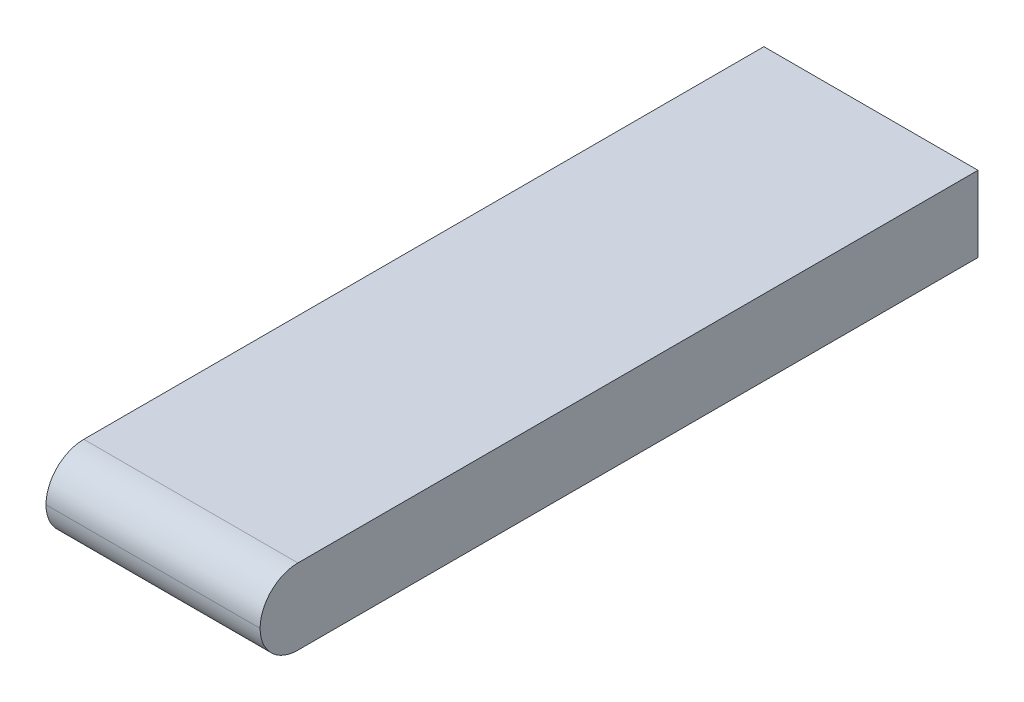
ISO-10303-21;
HEADER;
FILE_DESCRIPTION(('STEP AP214'),'2;1');
FILE_NAME('part.step','',(''),(''),'','','');
FILE_SCHEMA(('AUTOMOTIVE_DESIGN { 1 0 10303 214 1 1 1 1 }'));
ENDSEC;
DATA;
#1=APPLICATION_CONTEXT('core data for automotive mechanical design processes');
#2=APPLICATION_PROTOCOL_DEFINITION('international standard','automotive_design',2000,#1);
#3=PRODUCT_CONTEXT('',#1,'mechanical');
#4=PRODUCT('Part','Part','',(#3));
#5=PRODUCT_RELATED_PRODUCT_CATEGORY('part','',(#4));
#6=PRODUCT_DEFINITION_FORMATION('','',#4);
#7=PRODUCT_DEFINITION_CONTEXT('part definition',#1,'design');
#8=PRODUCT_DEFINITION('design','',#6,#7);
#9=PRODUCT_DEFINITION_SHAPE('','',#8);
#10=(LENGTH_UNIT() NAMED_UNIT(*) SI_UNIT(.MILLI.,.METRE.));
#11=(NAMED_UNIT(*) PLANE_ANGLE_UNIT() SI_UNIT($,.RADIAN.));
#12=(NAMED_UNIT(*) SI_UNIT($,.STERADIAN.) SOLID_ANGLE_UNIT());
#13=UNCERTAINTY_MEASURE_WITH_UNIT(LENGTH_MEASURE(1.E-05),#10,'distance_accuracy_value','');
#14=(GEOMETRIC_REPRESENTATION_CONTEXT(3) GLOBAL_UNCERTAINTY_ASSIGNED_CONTEXT((#13)) GLOBAL_UNIT_ASSIGNED_CONTEXT((#10,
#11,#12)) REPRESENTATION_CONTEXT('',''));
#15=CARTESIAN_POINT('',(0.,0.,0.));
#16=DIRECTION('',(0.,0.,1.));
#17=DIRECTION('',(1.,0.,0.));
#18=AXIS2_PLACEMENT_3D('',#15,#16,#17);
#19=CARTESIAN_POINT('',(-21.59,15.24,-72.39));
#20=DIRECTION('',(1.,0.,0.));
#21=DIRECTION('',(0.,0.,-1.));
#22=AXIS2_PLACEMENT_3D('',#19,#20,#21);
#23=PLANE('',#22);
#24=DIRECTION('',(0.,0.,1.));
#25=VECTOR('',#24,1.);
#26=CARTESIAN_POINT('',(-21.59,0.,-72.39));
#27=LINE('',#26,#25);
#28=CARTESIAN_POINT('',(-21.59,0.,-72.39));
#29=VERTEX_POINT('',#28);
#30=CARTESIAN_POINT('',(-21.59,0.,64.77));
#31=VERTEX_POINT('',#30);
#32=EDGE_CURVE('E104',#29,#31,#27,.T.);
#33=ORIENTED_EDGE('',*,*,#32,.T.);
#34=CARTESIAN_POINT('',(-21.59,7.62,64.77));
#35=DIRECTION('',(1.,0.,0.));
#36=DIRECTION('',(0.,0.,-1.));
#37=AXIS2_PLACEMENT_3D('',#34,#35,#36);
#38=CIRCLE('',#37,7.62);
#39=CARTESIAN_POINT('',(-21.59,7.62,72.39));
#40=VERTEX_POINT('',#39);
#41=EDGE_CURVE('E42',#31,#40,#38,.F.);
#42=ORIENTED_EDGE('',*,*,#41,.T.);
#43=CARTESIAN_POINT('',(-21.59,7.62,64.77));
#44=DIRECTION('',(1.,0.,0.));
#45=DIRECTION('',(0.,0.,-1.));
#46=AXIS2_PLACEMENT_3D('',#43,#44,#45);
#47=CIRCLE('',#46,7.62);
#48=CARTESIAN_POINT('',(-21.59,15.24,64.77));
#49=VERTEX_POINT('',#48);
#50=EDGE_CURVE('E49',#40,#49,#47,.F.);
#51=ORIENTED_EDGE('',*,*,#50,.T.);
#52=DIRECTION('',(0.,0.,1.));
#53=VECTOR('',#52,1.);
#54=CARTESIAN_POINT('',(-21.59,15.24,-72.39));
#55=LINE('',#54,#53);
#56=CARTESIAN_POINT('',(-21.59,15.24,-72.39));
#57=VERTEX_POINT('',#56);
#58=EDGE_CURVE('E86',#57,#49,#55,.T.);
#59=ORIENTED_EDGE('',*,*,#58,.F.);
#60=DIRECTION('',(0.,-1.,0.));
#61=VECTOR('',#60,1.);
#62=CARTESIAN_POINT('',(-21.59,15.24,-72.39));
#63=LINE('',#62,#61);
#64=EDGE_CURVE('E96',#57,#29,#63,.T.);
#65=ORIENTED_EDGE('',*,*,#64,.T.);
#66=EDGE_LOOP('',(#33,#42,#51,#59,#65));
#67=FACE_BOUND('',#66,.T.);
#68=ADVANCED_FACE('F33',(#67),#23,.F.);
#69=CARTESIAN_POINT('',(21.59,15.24,-72.39));
#70=DIRECTION('',(-1.,0.,0.));
#71=DIRECTION('',(0.,0.,1.));
#72=AXIS2_PLACEMENT_3D('',#69,#70,#71);
#73=PLANE('',#72);
#74=CARTESIAN_POINT('',(21.59,7.62,64.77));
#75=DIRECTION('',(-1.,0.,0.));
#76=DIRECTION('',(0.,0.,1.));
#77=AXIS2_PLACEMENT_3D('',#74,#75,#76);
#78=CIRCLE('',#77,7.62);
#79=CARTESIAN_POINT('',(21.59,15.24,64.77));
#80=VERTEX_POINT('',#79);
#81=CARTESIAN_POINT('',(21.59,7.62,72.39));
#82=VERTEX_POINT('',#81);
#83=EDGE_CURVE('E95',#80,#82,#78,.F.);
#84=ORIENTED_EDGE('',*,*,#83,.T.);
#85=CARTESIAN_POINT('',(21.59,7.62,64.77));
#86=DIRECTION('',(-1.,0.,0.));
#87=DIRECTION('',(0.,0.,1.));
#88=AXIS2_PLACEMENT_3D('',#85,#86,#87);
#89=CIRCLE('',#88,7.62);
#90=CARTESIAN_POINT('',(21.59,0.,64.77));
#91=VERTEX_POINT('',#90);
#92=EDGE_CURVE('E110',#82,#91,#89,.F.);
#93=ORIENTED_EDGE('',*,*,#92,.T.);
#94=DIRECTION('',(0.,0.,-1.));
#95=VECTOR('',#94,1.);
#96=CARTESIAN_POINT('',(21.59,0.,-72.39));
#97=LINE('',#96,#95);
#98=CARTESIAN_POINT('',(21.59,0.,-72.39));
#99=VERTEX_POINT('',#98);
#100=EDGE_CURVE('E92',#91,#99,#97,.T.);
#101=ORIENTED_EDGE('',*,*,#100,.T.);
#102=DIRECTION('',(0.,-1.,0.));
#103=VECTOR('',#102,1.);
#104=CARTESIAN_POINT('',(21.59,15.24,-72.39));
#105=LINE('',#104,#103);
#106=CARTESIAN_POINT('',(21.59,15.24,-72.39));
#107=VERTEX_POINT('',#106);
#108=EDGE_CURVE('E89',#107,#99,#105,.T.);
#109=ORIENTED_EDGE('',*,*,#108,.F.);
#110=DIRECTION('',(0.,0.,-1.));
#111=VECTOR('',#110,1.);
#112=CARTESIAN_POINT('',(21.59,15.24,-72.39));
#113=LINE('',#112,#111);
#114=EDGE_CURVE('E77',#80,#107,#113,.T.);
#115=ORIENTED_EDGE('',*,*,#114,.F.);
#116=EDGE_LOOP('',(#84,#93,#101,#109,#115));
#117=FACE_BOUND('',#116,.T.);
#118=ADVANCED_FACE('F90',(#117),#73,.F.);
#119=CARTESIAN_POINT('',(-21.59,15.24,-72.39));
#120=DIRECTION('',(0.,0.,1.));
#121=DIRECTION('',(1.,0.,0.));
#122=AXIS2_PLACEMENT_3D('',#119,#120,#121);
#123=PLANE('',#122);
#124=DIRECTION('',(-1.,0.,0.));
#125=VECTOR('',#124,1.);
#126=CARTESIAN_POINT('',(-21.59,0.,-72.39));
#127=LINE('',#126,#125);
#128=EDGE_CURVE('E107',#99,#29,#127,.T.);
#129=ORIENTED_EDGE('',*,*,#128,.T.);
#130=ORIENTED_EDGE('',*,*,#64,.F.);
#131=DIRECTION('',(-1.,0.,0.));
#132=VECTOR('',#131,1.);
#133=CARTESIAN_POINT('',(-21.59,15.24,-72.39));
#134=LINE('',#133,#132);
#135=EDGE_CURVE('E81',#107,#57,#134,.T.);
#136=ORIENTED_EDGE('',*,*,#135,.F.);
#137=ORIENTED_EDGE('',*,*,#108,.T.);
#138=EDGE_LOOP('',(#129,#130,#136,#137));
#139=FACE_BOUND('',#138,.T.);
#140=ADVANCED_FACE('F98',(#139),#123,.F.);
#141=CARTESIAN_POINT('',(0.,15.24,0.));
#142=DIRECTION('',(0.,1.,0.));
#143=DIRECTION('',(0.,0.,1.));
#144=AXIS2_PLACEMENT_3D('',#141,#142,#143);
#145=PLANE('',#144);
#146=ORIENTED_EDGE('',*,*,#58,.T.);
#147=DIRECTION('',(1.,0.,0.));
#148=VECTOR('',#147,1.);
#149=CARTESIAN_POINT('',(21.59,15.24,64.77));
#150=LINE('',#149,#148);
#151=EDGE_CURVE('E11',#49,#80,#150,.T.);
#152=ORIENTED_EDGE('',*,*,#151,.T.);
#153=ORIENTED_EDGE('',*,*,#114,.T.);
#154=ORIENTED_EDGE('',*,*,#135,.T.);
#155=EDGE_LOOP('',(#146,#152,#153,#154));
#156=FACE_BOUND('',#155,.T.);
#157=ADVANCED_FACE('F79',(#156),#145,.T.);
#158=CARTESIAN_POINT('',(0.,0.,0.));
#159=DIRECTION('',(0.,1.,0.));
#160=DIRECTION('',(0.,0.,1.));
#161=AXIS2_PLACEMENT_3D('',#158,#159,#160);
#162=PLANE('',#161);
#163=ORIENTED_EDGE('',*,*,#100,.F.);
#164=DIRECTION('',(1.,0.,0.));
#165=VECTOR('',#164,1.);
#166=CARTESIAN_POINT('',(0.,0.,64.77));
#167=LINE('',#166,#165);
#168=EDGE_CURVE('E112',#91,#31,#167,.F.);
#169=ORIENTED_EDGE('',*,*,#168,.T.);
#170=ORIENTED_EDGE('',*,*,#32,.F.);
#171=ORIENTED_EDGE('',*,*,#128,.F.);
#172=EDGE_LOOP('',(#163,#169,#170,#171));
#173=FACE_BOUND('',#172,.T.);
#174=ADVANCED_FACE('F119',(#173),#162,.F.);
#175=CARTESIAN_POINT('',(0.,7.62,64.77));
#176=DIRECTION('',(-1.,0.,0.));
#177=DIRECTION('',(0.,0.,1.));
#178=AXIS2_PLACEMENT_3D('',#175,#176,#177);
#179=CYLINDRICAL_SURFACE('',#178,7.62);
#180=ORIENTED_EDGE('',*,*,#151,.F.);
#181=ORIENTED_EDGE('',*,*,#50,.F.);
#182=DIRECTION('',(1.,0.,0.));
#183=VECTOR('',#182,1.);
#184=CARTESIAN_POINT('',(-21.59,7.62,72.39));
#185=LINE('',#184,#183);
#186=EDGE_CURVE('E37',#82,#40,#185,.F.);
#187=ORIENTED_EDGE('',*,*,#186,.F.);
#188=ORIENTED_EDGE('',*,*,#83,.F.);
#189=EDGE_LOOP('',(#180,#181,#187,#188));
#190=FACE_BOUND('',#189,.T.);
#191=ADVANCED_FACE('F35',(#190),#179,.T.);
#192=CARTESIAN_POINT('',(-21.59,7.62,64.77));
#193=DIRECTION('',(1.,0.,0.));
#194=DIRECTION('',(0.,0.,-1.));
#195=AXIS2_PLACEMENT_3D('',#192,#193,#194);
#196=CYLINDRICAL_SURFACE('',#195,7.62);
#197=ORIENTED_EDGE('',*,*,#41,.F.);
#198=ORIENTED_EDGE('',*,*,#168,.F.);
#199=ORIENTED_EDGE('',*,*,#92,.F.);
#200=ORIENTED_EDGE('',*,*,#186,.T.);
#201=EDGE_LOOP('',(#197,#198,#199,#200));
#202=FACE_BOUND('',#201,.T.);
#203=ADVANCED_FACE('F125',(#202),#196,.T.);
#204=CLOSED_SHELL('',(#68,#118,#140,#157,#174,#191,#203));
#205=MANIFOLD_SOLID_BREP('B2',#204);
#206=ADVANCED_BREP_SHAPE_REPRESENTATION('',(#18,#205),#14);
#207=SHAPE_DEFINITION_REPRESENTATION(#9,#206);
ENDSEC;
END-ISO-10303-21;
